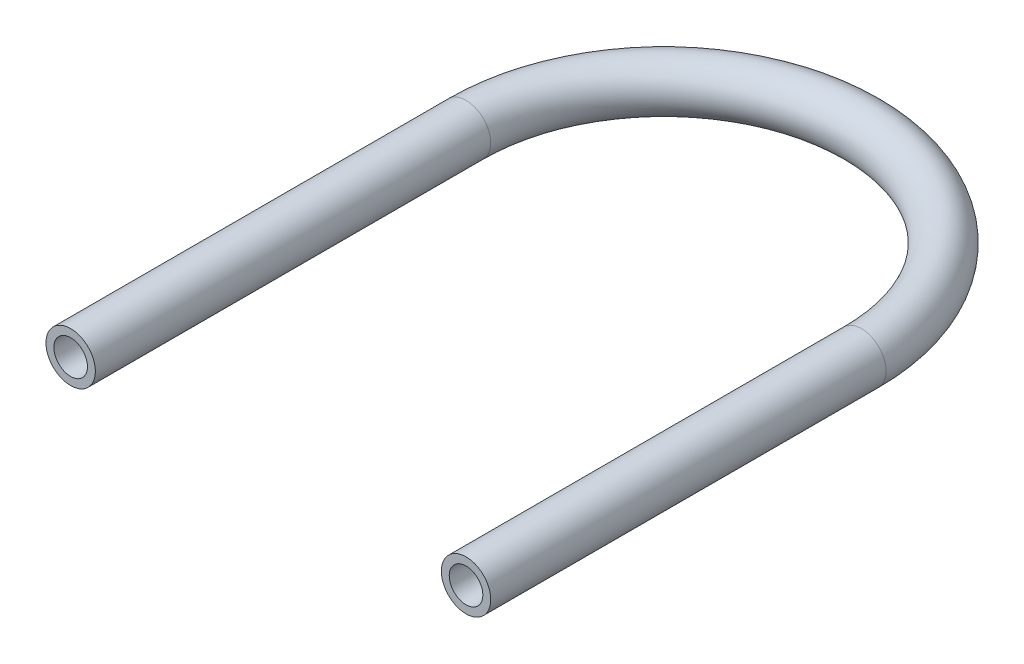
ISO-10303-21;
HEADER;
FILE_DESCRIPTION(('STEP AP214'),'2;1');
FILE_NAME('part.step','',(''),(''),'','','');
FILE_SCHEMA(('AUTOMOTIVE_DESIGN { 1 0 10303 214 1 1 1 1 }'));
ENDSEC;
DATA;
#1=APPLICATION_CONTEXT('core data for automotive mechanical design processes');
#2=APPLICATION_PROTOCOL_DEFINITION('international standard','automotive_design',2000,#1);
#3=PRODUCT_CONTEXT('',#1,'mechanical');
#4=PRODUCT('Part','Part','',(#3));
#5=PRODUCT_RELATED_PRODUCT_CATEGORY('part','',(#4));
#6=PRODUCT_DEFINITION_FORMATION('','',#4);
#7=PRODUCT_DEFINITION_CONTEXT('part definition',#1,'design');
#8=PRODUCT_DEFINITION('design','',#6,#7);
#9=PRODUCT_DEFINITION_SHAPE('','',#8);
#10=(LENGTH_UNIT() NAMED_UNIT(*) SI_UNIT(.MILLI.,.METRE.));
#11=(NAMED_UNIT(*) PLANE_ANGLE_UNIT() SI_UNIT($,.RADIAN.));
#12=(NAMED_UNIT(*) SI_UNIT($,.STERADIAN.) SOLID_ANGLE_UNIT());
#13=UNCERTAINTY_MEASURE_WITH_UNIT(LENGTH_MEASURE(1.E-05),#10,'distance_accuracy_value','');
#14=(GEOMETRIC_REPRESENTATION_CONTEXT(3) GLOBAL_UNCERTAINTY_ASSIGNED_CONTEXT((#13)) GLOBAL_UNIT_ASSIGNED_CONTEXT((#10,
#11,#12)) REPRESENTATION_CONTEXT('',''));
#15=CARTESIAN_POINT('',(0.,0.,0.));
#16=DIRECTION('',(0.,0.,1.));
#17=DIRECTION('',(1.,0.,0.));
#18=AXIS2_PLACEMENT_3D('',#15,#16,#17);
#19=CARTESIAN_POINT('',(25.4,0.,-50.8));
#20=DIRECTION('',(0.,0.,1.));
#21=DIRECTION('',(1.,0.,0.));
#22=AXIS2_PLACEMENT_3D('',#19,#20,#21);
#23=CYLINDRICAL_SURFACE('',#22,3.175);
#24=CARTESIAN_POINT('',(25.4,0.,-50.8));
#25=DIRECTION('',(0.,0.,-1.));
#26=DIRECTION('',(-1.,0.,0.));
#27=AXIS2_PLACEMENT_3D('',#24,#25,#26);
#28=CIRCLE('',#27,3.175);
#29=CARTESIAN_POINT('',(28.575,0.,-50.8));
#30=VERTEX_POINT('',#29);
#31=EDGE_CURVE('E41',#30,#30,#28,.T.);
#32=ORIENTED_EDGE('',*,*,#31,.F.);
#33=EDGE_LOOP('',(#32));
#34=FACE_BOUND('',#33,.T.);
#35=CARTESIAN_POINT('',(25.4,0.,0.));
#36=DIRECTION('',(0.,0.,-1.));
#37=DIRECTION('',(-1.,0.,0.));
#38=AXIS2_PLACEMENT_3D('',#35,#36,#37);
#39=CIRCLE('',#38,3.175);
#40=CARTESIAN_POINT('',(22.225,0.,0.));
#41=VERTEX_POINT('',#40);
#42=EDGE_CURVE('E10',#41,#41,#39,.T.);
#43=ORIENTED_EDGE('',*,*,#42,.T.);
#44=EDGE_LOOP('',(#43));
#45=FACE_BOUND('',#44,.T.);
#46=ADVANCED_FACE('F31',(#34,#45),#23,.T.);
#47=CARTESIAN_POINT('',(25.4,0.,-50.8));
#48=DIRECTION('',(0.,0.,1.));
#49=DIRECTION('',(1.,0.,0.));
#50=AXIS2_PLACEMENT_3D('',#47,#48,#49);
#51=CYLINDRICAL_SURFACE('',#50,2.159);
#52=CARTESIAN_POINT('',(25.4,0.,-50.8));
#53=DIRECTION('',(0.,0.,-1.));
#54=DIRECTION('',(-1.,0.,0.));
#55=AXIS2_PLACEMENT_3D('',#52,#53,#54);
#56=CIRCLE('',#55,2.159);
#57=CARTESIAN_POINT('',(27.559,0.,-50.8));
#58=VERTEX_POINT('',#57);
#59=EDGE_CURVE('E45',#58,#58,#56,.T.);
#60=ORIENTED_EDGE('',*,*,#59,.T.);
#61=EDGE_LOOP('',(#60));
#62=FACE_BOUND('',#61,.T.);
#63=CARTESIAN_POINT('',(25.4,0.,0.));
#64=DIRECTION('',(0.,0.,-1.));
#65=DIRECTION('',(-1.,0.,0.));
#66=AXIS2_PLACEMENT_3D('',#63,#64,#65);
#67=CIRCLE('',#66,2.159);
#68=CARTESIAN_POINT('',(23.241,0.,0.));
#69=VERTEX_POINT('',#68);
#70=EDGE_CURVE('E37',#69,#69,#67,.T.);
#71=ORIENTED_EDGE('',*,*,#70,.F.);
#72=EDGE_LOOP('',(#71));
#73=FACE_BOUND('',#72,.T.);
#74=ADVANCED_FACE('F88',(#62,#73),#51,.F.);
#75=CARTESIAN_POINT('',(0.,0.,-50.8));
#76=DIRECTION('',(0.,-1.,0.));
#77=DIRECTION('',(0.,0.,-1.));
#78=AXIS2_PLACEMENT_3D('',#75,#76,#77);
#79=TOROIDAL_SURFACE('',#78,25.4,3.175);
#80=CARTESIAN_POINT('',(-25.4,0.,-50.8));
#81=DIRECTION('',(0.,0.,1.));
#82=DIRECTION('',(1.,0.,0.));
#83=AXIS2_PLACEMENT_3D('',#80,#81,#82);
#84=CIRCLE('',#83,3.175);
#85=CARTESIAN_POINT('',(-28.575,0.,-50.8));
#86=VERTEX_POINT('',#85);
#87=EDGE_CURVE('E50',#86,#86,#84,.T.);
#88=CARTESIAN_POINT('',(0.,0.,-50.8));
#89=DIRECTION('',(0.,-1.,0.));
#90=DIRECTION('',(0.,0.,-1.));
#91=AXIS2_PLACEMENT_3D('',#88,#89,#90);
#92=CIRCLE('',#91,28.575);
#93=EDGE_CURVE('',#86,#30,#92,.T.);
#94=ORIENTED_EDGE('',*,*,#87,.F.);
#95=ORIENTED_EDGE('',*,*,#31,.T.);
#96=ORIENTED_EDGE('',*,*,#93,.T.);
#97=ORIENTED_EDGE('',*,*,#93,.F.);
#98=EDGE_LOOP('',(#94,#96,#95,#97));
#99=FACE_BOUND('',#98,.T.);
#100=ADVANCED_FACE('F93',(#99),#79,.T.);
#101=CARTESIAN_POINT('',(0.,0.,-50.8));
#102=DIRECTION('',(0.,-1.,0.));
#103=DIRECTION('',(0.,0.,-1.));
#104=AXIS2_PLACEMENT_3D('',#101,#102,#103);
#105=TOROIDAL_SURFACE('',#104,25.4,2.159);
#106=CARTESIAN_POINT('',(-25.4,0.,-50.8));
#107=DIRECTION('',(0.,0.,1.));
#108=DIRECTION('',(1.,0.,0.));
#109=AXIS2_PLACEMENT_3D('',#106,#107,#108);
#110=CIRCLE('',#109,2.159);
#111=CARTESIAN_POINT('',(-27.559,0.,-50.8));
#112=VERTEX_POINT('',#111);
#113=EDGE_CURVE('E54',#112,#112,#110,.T.);
#114=CARTESIAN_POINT('',(0.,0.,-50.8));
#115=DIRECTION('',(0.,-1.,0.));
#116=DIRECTION('',(0.,0.,-1.));
#117=AXIS2_PLACEMENT_3D('',#114,#115,#116);
#118=CIRCLE('',#117,27.559);
#119=EDGE_CURVE('',#112,#58,#118,.T.);
#120=ORIENTED_EDGE('',*,*,#113,.T.);
#121=ORIENTED_EDGE('',*,*,#59,.F.);
#122=ORIENTED_EDGE('',*,*,#119,.T.);
#123=ORIENTED_EDGE('',*,*,#119,.F.);
#124=EDGE_LOOP('',(#120,#122,#121,#123));
#125=FACE_BOUND('',#124,.T.);
#126=ADVANCED_FACE('F63',(#125),#105,.F.);
#127=CARTESIAN_POINT('',(-25.4,0.,-50.8));
#128=DIRECTION('',(0.,0.,1.));
#129=DIRECTION('',(1.,0.,0.));
#130=AXIS2_PLACEMENT_3D('',#127,#128,#129);
#131=CYLINDRICAL_SURFACE('',#130,2.159);
#132=ORIENTED_EDGE('',*,*,#113,.F.);
#133=EDGE_LOOP('',(#132));
#134=FACE_BOUND('',#133,.T.);
#135=CARTESIAN_POINT('',(-25.4,0.,0.));
#136=DIRECTION('',(0.,0.,1.));
#137=DIRECTION('',(1.,0.,0.));
#138=AXIS2_PLACEMENT_3D('',#135,#136,#137);
#139=CIRCLE('',#138,2.159);
#140=CARTESIAN_POINT('',(-23.241,0.,0.));
#141=VERTEX_POINT('',#140);
#142=EDGE_CURVE('E55',#141,#141,#139,.T.);
#143=ORIENTED_EDGE('',*,*,#142,.T.);
#144=EDGE_LOOP('',(#143));
#145=FACE_BOUND('',#144,.T.);
#146=ADVANCED_FACE('F66',(#134,#145),#131,.F.);
#147=CARTESIAN_POINT('',(-25.4,0.,-50.8));
#148=DIRECTION('',(0.,0.,1.));
#149=DIRECTION('',(1.,0.,0.));
#150=AXIS2_PLACEMENT_3D('',#147,#148,#149);
#151=CYLINDRICAL_SURFACE('',#150,3.175);
#152=ORIENTED_EDGE('',*,*,#87,.T.);
#153=EDGE_LOOP('',(#152));
#154=FACE_BOUND('',#153,.T.);
#155=CARTESIAN_POINT('',(-25.4,0.,0.));
#156=DIRECTION('',(0.,0.,1.));
#157=DIRECTION('',(1.,0.,0.));
#158=AXIS2_PLACEMENT_3D('',#155,#156,#157);
#159=CIRCLE('',#158,3.175);
#160=CARTESIAN_POINT('',(-22.225,0.,0.));
#161=VERTEX_POINT('',#160);
#162=EDGE_CURVE('E51',#161,#161,#159,.T.);
#163=ORIENTED_EDGE('',*,*,#162,.F.);
#164=EDGE_LOOP('',(#163));
#165=FACE_BOUND('',#164,.T.);
#166=ADVANCED_FACE('F69',(#154,#165),#151,.T.);
#167=CARTESIAN_POINT('',(25.4,0.,0.));
#168=DIRECTION('',(0.,0.,-1.));
#169=DIRECTION('',(-1.,0.,0.));
#170=AXIS2_PLACEMENT_3D('',#167,#168,#169);
#171=PLANE('',#170);
#172=ORIENTED_EDGE('',*,*,#70,.T.);
#173=EDGE_LOOP('',(#172));
#174=FACE_BOUND('',#173,.T.);
#175=ORIENTED_EDGE('',*,*,#42,.F.);
#176=EDGE_LOOP('',(#175));
#177=FACE_BOUND('',#176,.T.);
#178=ADVANCED_FACE('F76',(#174,#177),#171,.F.);
#179=CARTESIAN_POINT('',(-25.4,0.,0.));
#180=DIRECTION('',(0.,0.,1.));
#181=DIRECTION('',(1.,0.,0.));
#182=AXIS2_PLACEMENT_3D('',#179,#180,#181);
#183=PLANE('',#182);
#184=ORIENTED_EDGE('',*,*,#142,.F.);
#185=EDGE_LOOP('',(#184));
#186=FACE_BOUND('',#185,.T.);
#187=ORIENTED_EDGE('',*,*,#162,.T.);
#188=EDGE_LOOP('',(#187));
#189=FACE_BOUND('',#188,.T.);
#190=ADVANCED_FACE('F73',(#186,#189),#183,.T.);
#191=CLOSED_SHELL('',(#46,#74,#100,#126,#146,#166,#178,#190));
#192=MANIFOLD_SOLID_BREP('B2',#191);
#193=ADVANCED_BREP_SHAPE_REPRESENTATION('',(#18,#192),#14);
#194=SHAPE_DEFINITION_REPRESENTATION(#9,#193);
ENDSEC;
END-ISO-10303-21;
